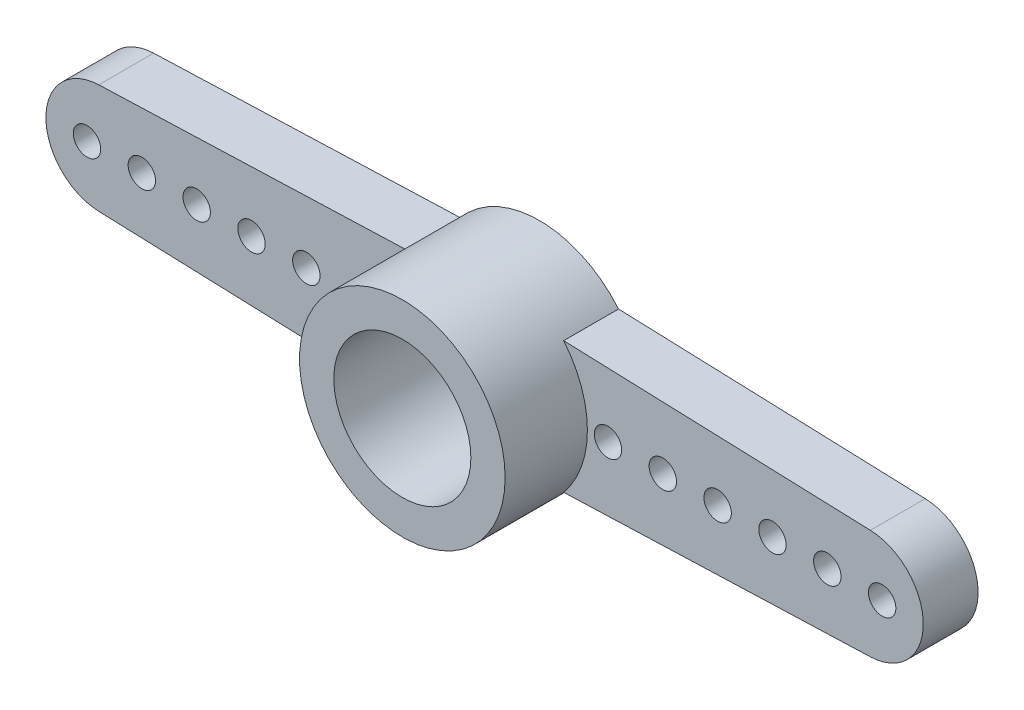
ISO-10303-21;
HEADER;
FILE_DESCRIPTION(('STEP AP214'),'2;1');
FILE_NAME('part.step','',(''),(''),'','','');
FILE_SCHEMA(('AUTOMOTIVE_DESIGN { 1 0 10303 214 1 1 1 1 }'));
ENDSEC;
DATA;
#1=APPLICATION_CONTEXT('core data for automotive mechanical design processes');
#2=APPLICATION_PROTOCOL_DEFINITION('international standard','automotive_design',2000,#1);
#3=PRODUCT_CONTEXT('',#1,'mechanical');
#4=PRODUCT('Part','Part','',(#3));
#5=PRODUCT_RELATED_PRODUCT_CATEGORY('part','',(#4));
#6=PRODUCT_DEFINITION_FORMATION('','',#4);
#7=PRODUCT_DEFINITION_CONTEXT('part definition',#1,'design');
#8=PRODUCT_DEFINITION('design','',#6,#7);
#9=PRODUCT_DEFINITION_SHAPE('','',#8);
#10=(LENGTH_UNIT() NAMED_UNIT(*) SI_UNIT(.MILLI.,.METRE.));
#11=(NAMED_UNIT(*) PLANE_ANGLE_UNIT() SI_UNIT($,.RADIAN.));
#12=(NAMED_UNIT(*) SI_UNIT($,.STERADIAN.) SOLID_ANGLE_UNIT());
#13=UNCERTAINTY_MEASURE_WITH_UNIT(LENGTH_MEASURE(1.E-05),#10,'distance_accuracy_value','');
#14=(GEOMETRIC_REPRESENTATION_CONTEXT(3) GLOBAL_UNCERTAINTY_ASSIGNED_CONTEXT((#13)) GLOBAL_UNIT_ASSIGNED_CONTEXT((#10,
#11,#12)) REPRESENTATION_CONTEXT('',''));
#15=CARTESIAN_POINT('',(0.,0.,0.));
#16=DIRECTION('',(0.,0.,1.));
#17=DIRECTION('',(1.,0.,0.));
#18=AXIS2_PLACEMENT_3D('',#15,#16,#17);
#19=CARTESIAN_POINT('',(0.,0.,0.));
#20=DIRECTION('',(0.,0.,1.));
#21=DIRECTION('',(1.,0.,0.));
#22=AXIS2_PLACEMENT_3D('',#19,#20,#21);
#23=CYLINDRICAL_SURFACE('',#22,2.5);
#24=CARTESIAN_POINT('',(0.,0.,5.));
#25=DIRECTION('',(0.,0.,1.));
#26=DIRECTION('',(1.,0.,0.));
#27=AXIS2_PLACEMENT_3D('',#24,#25,#26);
#28=CIRCLE('',#27,2.5);
#29=CARTESIAN_POINT('',(2.5,0.,5.));
#30=VERTEX_POINT('',#29);
#31=EDGE_CURVE('E347',#30,#30,#28,.T.);
#32=ORIENTED_EDGE('',*,*,#31,.T.);
#33=EDGE_LOOP('',(#32));
#34=FACE_BOUND('',#33,.T.);
#35=CARTESIAN_POINT('',(0.,0.,1.));
#36=DIRECTION('',(0.,0.,-1.));
#37=DIRECTION('',(-1.,0.,0.));
#38=AXIS2_PLACEMENT_3D('',#35,#36,#37);
#39=CIRCLE('',#38,2.5);
#40=CARTESIAN_POINT('',(-2.5,0.,1.));
#41=VERTEX_POINT('',#40);
#42=EDGE_CURVE('E254',#41,#41,#39,.T.);
#43=ORIENTED_EDGE('',*,*,#42,.T.);
#44=EDGE_LOOP('',(#43));
#45=FACE_BOUND('',#44,.T.);
#46=ADVANCED_FACE('F46',(#34,#45),#23,.F.);
#47=CARTESIAN_POINT('',(0.,0.,2.));
#48=DIRECTION('',(0.,0.,1.));
#49=DIRECTION('',(1.,0.,0.));
#50=AXIS2_PLACEMENT_3D('',#47,#48,#49);
#51=PLANE('',#50);
#52=CARTESIAN_POINT('',(-12.5,0.,2.));
#53=DIRECTION('',(0.,0.,-1.));
#54=DIRECTION('',(-1.,0.,0.));
#55=AXIS2_PLACEMENT_3D('',#52,#53,#54);
#56=CIRCLE('',#55,0.500000000000001);
#57=CARTESIAN_POINT('',(-13.,0.,2.));
#58=VERTEX_POINT('',#57);
#59=EDGE_CURVE('E268',#58,#58,#56,.F.);
#60=ORIENTED_EDGE('',*,*,#59,.F.);
#61=EDGE_LOOP('',(#60));
#62=FACE_BOUND('',#61,.T.);
#63=CARTESIAN_POINT('',(-8.5,0.,2.));
#64=DIRECTION('',(0.,0.,-1.));
#65=DIRECTION('',(-1.,0.,0.));
#66=AXIS2_PLACEMENT_3D('',#63,#64,#65);
#67=CIRCLE('',#66,0.500000000000001);
#68=CARTESIAN_POINT('',(-9.,0.,2.));
#69=VERTEX_POINT('',#68);
#70=EDGE_CURVE('E292',#69,#69,#67,.F.);
#71=ORIENTED_EDGE('',*,*,#70,.F.);
#72=EDGE_LOOP('',(#71));
#73=FACE_BOUND('',#72,.T.);
#74=CARTESIAN_POINT('',(-4.5,0.,2.));
#75=DIRECTION('',(0.,0.,-1.));
#76=DIRECTION('',(-1.,0.,0.));
#77=AXIS2_PLACEMENT_3D('',#74,#75,#76);
#78=CIRCLE('',#77,0.500000000000001);
#79=CARTESIAN_POINT('',(-5.,0.,2.));
#80=VERTEX_POINT('',#79);
#81=EDGE_CURVE('E305',#80,#80,#78,.F.);
#82=ORIENTED_EDGE('',*,*,#81,.F.);
#83=EDGE_LOOP('',(#82));
#84=FACE_BOUND('',#83,.T.);
#85=CARTESIAN_POINT('',(0.,0.,2.));
#86=DIRECTION('',(0.,0.,1.));
#87=DIRECTION('',(1.,0.,0.));
#88=AXIS2_PLACEMENT_3D('',#85,#86,#87);
#89=CIRCLE('',#88,3.75);
#90=CARTESIAN_POINT('',(-2.88547071027724,2.39511143376089,2.));
#91=VERTEX_POINT('',#90);
#92=CARTESIAN_POINT('',(-2.88547071027724,-2.39511143376089,2.));
#93=VERTEX_POINT('',#92);
#94=EDGE_CURVE('E12',#91,#93,#89,.T.);
#95=ORIENTED_EDGE('',*,*,#94,.F.);
#96=DIRECTION('',(0.999372730394994,0.0354139201848026,0.));
#97=VECTOR('',#96,1.);
#98=CARTESIAN_POINT('',(-0.0883858807695831,2.49422934631706,2.));
#99=LINE('',#98,#97);
#100=CARTESIAN_POINT('',(-14.0708278403696,1.99874546078999,2.));
#101=VERTEX_POINT('',#100);
#102=EDGE_CURVE('E215',#101,#91,#99,.T.);
#103=ORIENTED_EDGE('',*,*,#102,.F.);
#104=CARTESIAN_POINT('',(-14.,0.,2.));
#105=DIRECTION('',(0.,0.,1.));
#106=DIRECTION('',(1.,0.,0.));
#107=AXIS2_PLACEMENT_3D('',#104,#105,#106);
#108=CIRCLE('',#107,2.);
#109=CARTESIAN_POINT('',(-14.0708278403696,-1.99874546078999,2.));
#110=VERTEX_POINT('',#109);
#111=EDGE_CURVE('E206',#110,#101,#108,.F.);
#112=ORIENTED_EDGE('',*,*,#111,.F.);
#113=DIRECTION('',(0.999372730394994,-0.0354139201848024,0.));
#114=VECTOR('',#113,1.);
#115=CARTESIAN_POINT('',(-0.0883858807695825,-2.49422934631706,2.));
#116=LINE('',#115,#114);
#117=EDGE_CURVE('E211',#110,#93,#116,.T.);
#118=ORIENTED_EDGE('',*,*,#117,.T.);
#119=EDGE_LOOP('',(#95,#103,#112,#118));
#120=FACE_BOUND('',#119,.T.);
#121=CARTESIAN_POINT('',(-6.5,0.,2.));
#122=DIRECTION('',(0.,0.,-1.));
#123=DIRECTION('',(-1.,0.,0.));
#124=AXIS2_PLACEMENT_3D('',#121,#122,#123);
#125=CIRCLE('',#124,0.500000000000001);
#126=CARTESIAN_POINT('',(-7.,0.,2.));
#127=VERTEX_POINT('',#126);
#128=EDGE_CURVE('E299',#127,#127,#125,.F.);
#129=ORIENTED_EDGE('',*,*,#128,.F.);
#130=EDGE_LOOP('',(#129));
#131=FACE_BOUND('',#130,.T.);
#132=CARTESIAN_POINT('',(-10.5,0.,2.));
#133=DIRECTION('',(0.,0.,-1.));
#134=DIRECTION('',(-1.,0.,0.));
#135=AXIS2_PLACEMENT_3D('',#132,#133,#134);
#136=CIRCLE('',#135,0.500000000000001);
#137=CARTESIAN_POINT('',(-11.,0.,2.));
#138=VERTEX_POINT('',#137);
#139=EDGE_CURVE('E286',#138,#138,#136,.F.);
#140=ORIENTED_EDGE('',*,*,#139,.F.);
#141=EDGE_LOOP('',(#140));
#142=FACE_BOUND('',#141,.T.);
#143=CARTESIAN_POINT('',(-14.5,0.,2.));
#144=DIRECTION('',(0.,0.,-1.));
#145=DIRECTION('',(-1.,0.,0.));
#146=AXIS2_PLACEMENT_3D('',#143,#144,#145);
#147=CIRCLE('',#146,0.500000000000001);
#148=CARTESIAN_POINT('',(-15.,0.,2.));
#149=VERTEX_POINT('',#148);
#150=EDGE_CURVE('E269',#149,#149,#147,.F.);
#151=ORIENTED_EDGE('',*,*,#150,.F.);
#152=EDGE_LOOP('',(#151));
#153=FACE_BOUND('',#152,.T.);
#154=ADVANCED_FACE('F216',(#62,#73,#84,#120,#131,#142,#153),#51,.T.);
#155=CARTESIAN_POINT('',(0.,0.,0.));
#156=DIRECTION('',(0.,0.,1.));
#157=DIRECTION('',(1.,0.,0.));
#158=AXIS2_PLACEMENT_3D('',#155,#156,#157);
#159=PLANE('',#158);
#160=CARTESIAN_POINT('',(0.,0.,0.));
#161=DIRECTION('',(0.,0.,-1.));
#162=DIRECTION('',(-1.,0.,0.));
#163=AXIS2_PLACEMENT_3D('',#160,#161,#162);
#164=CIRCLE('',#163,2.5);
#165=CARTESIAN_POINT('',(-2.5,0.,0.));
#166=VERTEX_POINT('',#165);
#167=EDGE_CURVE('E248',#166,#166,#164,.T.);
#168=ORIENTED_EDGE('',*,*,#167,.F.);
#169=EDGE_LOOP('',(#168));
#170=FACE_BOUND('',#169,.T.);
#171=CARTESIAN_POINT('',(12.5,0.,0.));
#172=DIRECTION('',(0.,0.,-1.));
#173=DIRECTION('',(-1.,0.,0.));
#174=AXIS2_PLACEMENT_3D('',#171,#172,#173);
#175=CIRCLE('',#174,0.500000000000001);
#176=CARTESIAN_POINT('',(12.,0.,0.));
#177=VERTEX_POINT('',#176);
#178=EDGE_CURVE('E279',#177,#177,#175,.T.);
#179=ORIENTED_EDGE('',*,*,#178,.F.);
#180=EDGE_LOOP('',(#179));
#181=FACE_BOUND('',#180,.T.);
#182=CARTESIAN_POINT('',(-12.5,0.,0.));
#183=DIRECTION('',(0.,0.,-1.));
#184=DIRECTION('',(-1.,0.,0.));
#185=AXIS2_PLACEMENT_3D('',#182,#183,#184);
#186=CIRCLE('',#185,0.500000000000001);
#187=CARTESIAN_POINT('',(-13.,0.,0.));
#188=VERTEX_POINT('',#187);
#189=EDGE_CURVE('E275',#188,#188,#186,.F.);
#190=ORIENTED_EDGE('',*,*,#189,.T.);
#191=EDGE_LOOP('',(#190));
#192=FACE_BOUND('',#191,.T.);
#193=CARTESIAN_POINT('',(-8.5,0.,0.));
#194=DIRECTION('',(0.,0.,-1.));
#195=DIRECTION('',(-1.,0.,0.));
#196=AXIS2_PLACEMENT_3D('',#193,#194,#195);
#197=CIRCLE('',#196,0.500000000000001);
#198=CARTESIAN_POINT('',(-9.,0.,0.));
#199=VERTEX_POINT('',#198);
#200=EDGE_CURVE('E295',#199,#199,#197,.F.);
#201=ORIENTED_EDGE('',*,*,#200,.T.);
#202=EDGE_LOOP('',(#201));
#203=FACE_BOUND('',#202,.T.);
#204=CARTESIAN_POINT('',(-4.5,0.,0.));
#205=DIRECTION('',(0.,0.,-1.));
#206=DIRECTION('',(-1.,0.,0.));
#207=AXIS2_PLACEMENT_3D('',#204,#205,#206);
#208=CIRCLE('',#207,0.500000000000001);
#209=CARTESIAN_POINT('',(-5.,0.,0.));
#210=VERTEX_POINT('',#209);
#211=EDGE_CURVE('E308',#210,#210,#208,.F.);
#212=ORIENTED_EDGE('',*,*,#211,.T.);
#213=EDGE_LOOP('',(#212));
#214=FACE_BOUND('',#213,.T.);
#215=CARTESIAN_POINT('',(4.5,0.,0.));
#216=DIRECTION('',(0.,0.,-1.));
#217=DIRECTION('',(-1.,0.,0.));
#218=AXIS2_PLACEMENT_3D('',#215,#216,#217);
#219=CIRCLE('',#218,0.500000000000001);
#220=CARTESIAN_POINT('',(4.,0.,0.));
#221=VERTEX_POINT('',#220);
#222=EDGE_CURVE('E315',#221,#221,#219,.T.);
#223=ORIENTED_EDGE('',*,*,#222,.F.);
#224=EDGE_LOOP('',(#223));
#225=FACE_BOUND('',#224,.T.);
#226=CARTESIAN_POINT('',(6.5,0.,0.));
#227=DIRECTION('',(0.,0.,-1.));
#228=DIRECTION('',(-1.,0.,0.));
#229=AXIS2_PLACEMENT_3D('',#226,#227,#228);
#230=CIRCLE('',#229,0.500000000000001);
#231=CARTESIAN_POINT('',(6.,0.,0.));
#232=VERTEX_POINT('',#231);
#233=EDGE_CURVE('E321',#232,#232,#230,.T.);
#234=ORIENTED_EDGE('',*,*,#233,.F.);
#235=EDGE_LOOP('',(#234));
#236=FACE_BOUND('',#235,.T.);
#237=CARTESIAN_POINT('',(8.5,0.,0.));
#238=DIRECTION('',(0.,0.,-1.));
#239=DIRECTION('',(-1.,0.,0.));
#240=AXIS2_PLACEMENT_3D('',#237,#238,#239);
#241=CIRCLE('',#240,0.500000000000001);
#242=CARTESIAN_POINT('',(8.,0.,0.));
#243=VERTEX_POINT('',#242);
#244=EDGE_CURVE('E328',#243,#243,#241,.T.);
#245=ORIENTED_EDGE('',*,*,#244,.F.);
#246=EDGE_LOOP('',(#245));
#247=FACE_BOUND('',#246,.T.);
#248=CARTESIAN_POINT('',(10.5,0.,0.));
#249=DIRECTION('',(0.,0.,-1.));
#250=DIRECTION('',(-1.,0.,0.));
#251=AXIS2_PLACEMENT_3D('',#248,#249,#250);
#252=CIRCLE('',#251,0.500000000000001);
#253=CARTESIAN_POINT('',(10.,0.,0.));
#254=VERTEX_POINT('',#253);
#255=EDGE_CURVE('E336',#254,#254,#252,.T.);
#256=ORIENTED_EDGE('',*,*,#255,.F.);
#257=EDGE_LOOP('',(#256));
#258=FACE_BOUND('',#257,.T.);
#259=CARTESIAN_POINT('',(14.5,0.,0.));
#260=DIRECTION('',(0.,0.,-1.));
#261=DIRECTION('',(-1.,0.,0.));
#262=AXIS2_PLACEMENT_3D('',#259,#260,#261);
#263=CIRCLE('',#262,0.500000000000001);
#264=CARTESIAN_POINT('',(14.,0.,0.));
#265=VERTEX_POINT('',#264);
#266=EDGE_CURVE('E340',#265,#265,#263,.T.);
#267=ORIENTED_EDGE('',*,*,#266,.F.);
#268=EDGE_LOOP('',(#267));
#269=FACE_BOUND('',#268,.T.);
#270=DIRECTION('',(-0.999372730394994,-0.0354139201848029,0.));
#271=VECTOR('',#270,1.);
#272=CARTESIAN_POINT('',(0.0883858807695838,-2.49422934631706,0.));
#273=LINE('',#272,#271);
#274=CARTESIAN_POINT('',(14.0708278403696,-1.99874546078998,0.));
#275=VERTEX_POINT('',#274);
#276=CARTESIAN_POINT('',(2.88547071027724,-2.39511143376089,0.));
#277=VERTEX_POINT('',#276);
#278=EDGE_CURVE('E130',#275,#277,#273,.T.);
#279=ORIENTED_EDGE('',*,*,#278,.T.);
#280=CARTESIAN_POINT('',(0.,0.,0.));
#281=DIRECTION('',(0.,0.,-1.));
#282=DIRECTION('',(-1.,0.,0.));
#283=AXIS2_PLACEMENT_3D('',#280,#281,#282);
#284=CIRCLE('',#283,3.75);
#285=CARTESIAN_POINT('',(-2.88547071027724,-2.39511143376089,0.));
#286=VERTEX_POINT('',#285);
#287=EDGE_CURVE('E103',#277,#286,#284,.T.);
#288=ORIENTED_EDGE('',*,*,#287,.T.);
#289=DIRECTION('',(0.999372730394994,-0.0354139201848024,0.));
#290=VECTOR('',#289,1.);
#291=CARTESIAN_POINT('',(-0.0883858807695825,-2.49422934631706,0.));
#292=LINE('',#291,#290);
#293=CARTESIAN_POINT('',(-14.0708278403696,-1.99874546078999,0.));
#294=VERTEX_POINT('',#293);
#295=EDGE_CURVE('E172',#294,#286,#292,.T.);
#296=ORIENTED_EDGE('',*,*,#295,.F.);
#297=CARTESIAN_POINT('',(-14.,0.,0.));
#298=DIRECTION('',(0.,0.,1.));
#299=DIRECTION('',(1.,0.,0.));
#300=AXIS2_PLACEMENT_3D('',#297,#298,#299);
#301=CIRCLE('',#300,2.);
#302=CARTESIAN_POINT('',(-14.0708278403696,1.99874546078999,0.));
#303=VERTEX_POINT('',#302);
#304=EDGE_CURVE('E208',#294,#303,#301,.F.);
#305=ORIENTED_EDGE('',*,*,#304,.T.);
#306=DIRECTION('',(0.999372730394994,0.0354139201848026,0.));
#307=VECTOR('',#306,1.);
#308=CARTESIAN_POINT('',(-0.0883858807695831,2.49422934631706,0.));
#309=LINE('',#308,#307);
#310=CARTESIAN_POINT('',(-2.88547071027724,2.39511143376089,0.));
#311=VERTEX_POINT('',#310);
#312=EDGE_CURVE('E64',#303,#311,#309,.T.);
#313=ORIENTED_EDGE('',*,*,#312,.T.);
#314=CARTESIAN_POINT('',(2.88547071027724,2.39511143376089,0.));
#315=VERTEX_POINT('',#314);
#316=EDGE_CURVE('E92',#311,#315,#284,.T.);
#317=ORIENTED_EDGE('',*,*,#316,.T.);
#318=DIRECTION('',(-0.999372730394994,0.0354139201848023,0.));
#319=VECTOR('',#318,1.);
#320=CARTESIAN_POINT('',(0.0883858807695825,2.49422934631706,0.));
#321=LINE('',#320,#319);
#322=CARTESIAN_POINT('',(14.0708278403696,1.99874546078999,0.));
#323=VERTEX_POINT('',#322);
#324=EDGE_CURVE('E99',#323,#315,#321,.T.);
#325=ORIENTED_EDGE('',*,*,#324,.F.);
#326=CARTESIAN_POINT('',(14.,0.,0.));
#327=DIRECTION('',(0.,0.,1.));
#328=DIRECTION('',(1.,0.,0.));
#329=AXIS2_PLACEMENT_3D('',#326,#327,#328);
#330=CIRCLE('',#329,2.);
#331=EDGE_CURVE('E123',#275,#323,#330,.T.);
#332=ORIENTED_EDGE('',*,*,#331,.F.);
#333=EDGE_LOOP('',(#279,#288,#296,#305,#313,#317,#325,#332));
#334=FACE_BOUND('',#333,.T.);
#335=CARTESIAN_POINT('',(-6.5,0.,0.));
#336=DIRECTION('',(0.,0.,-1.));
#337=DIRECTION('',(-1.,0.,0.));
#338=AXIS2_PLACEMENT_3D('',#335,#336,#337);
#339=CIRCLE('',#338,0.500000000000001);
#340=CARTESIAN_POINT('',(-7.,0.,0.));
#341=VERTEX_POINT('',#340);
#342=EDGE_CURVE('E302',#341,#341,#339,.F.);
#343=ORIENTED_EDGE('',*,*,#342,.T.);
#344=EDGE_LOOP('',(#343));
#345=FACE_BOUND('',#344,.T.);
#346=CARTESIAN_POINT('',(-10.5,0.,0.));
#347=DIRECTION('',(0.,0.,-1.));
#348=DIRECTION('',(-1.,0.,0.));
#349=AXIS2_PLACEMENT_3D('',#346,#347,#348);
#350=CIRCLE('',#349,0.500000000000001);
#351=CARTESIAN_POINT('',(-11.,0.,0.));
#352=VERTEX_POINT('',#351);
#353=EDGE_CURVE('E288',#352,#352,#350,.F.);
#354=ORIENTED_EDGE('',*,*,#353,.T.);
#355=EDGE_LOOP('',(#354));
#356=FACE_BOUND('',#355,.T.);
#357=CARTESIAN_POINT('',(-14.5,0.,0.));
#358=DIRECTION('',(0.,0.,-1.));
#359=DIRECTION('',(-1.,0.,0.));
#360=AXIS2_PLACEMENT_3D('',#357,#358,#359);
#361=CIRCLE('',#360,0.500000000000001);
#362=CARTESIAN_POINT('',(-15.,0.,0.));
#363=VERTEX_POINT('',#362);
#364=EDGE_CURVE('E266',#363,#363,#361,.F.);
#365=ORIENTED_EDGE('',*,*,#364,.T.);
#366=EDGE_LOOP('',(#365));
#367=FACE_BOUND('',#366,.T.);
#368=ADVANCED_FACE('F95',(#170,#181,#192,#203,#214,#225,#236,#247,#258,#269,#334,#345,#356,
#367),#159,.F.);
#369=CARTESIAN_POINT('',(0.0883858807695838,-2.49422934631706,2.));
#370=DIRECTION('',(0.0354139201848029,-0.999372730394994,0.));
#371=DIRECTION('',(0.999372730394994,0.0354139201848029,0.));
#372=AXIS2_PLACEMENT_3D('',#369,#370,#371);
#373=PLANE('',#372);
#374=ORIENTED_EDGE('',*,*,#278,.F.);
#375=DIRECTION('',(0.,0.,-1.));
#376=VECTOR('',#375,1.);
#377=CARTESIAN_POINT('',(14.0708278403696,-1.99874546078998,2.));
#378=LINE('',#377,#376);
#379=CARTESIAN_POINT('',(14.0708278403696,-1.99874546078998,2.));
#380=VERTEX_POINT('',#379);
#381=EDGE_CURVE('E136',#380,#275,#378,.T.);
#382=ORIENTED_EDGE('',*,*,#381,.F.);
#383=DIRECTION('',(-0.999372730394994,-0.0354139201848029,0.));
#384=VECTOR('',#383,1.);
#385=CARTESIAN_POINT('',(0.0883858807695838,-2.49422934631706,2.));
#386=LINE('',#385,#384);
#387=CARTESIAN_POINT('',(2.88547071027724,-2.39511143376089,2.));
#388=VERTEX_POINT('',#387);
#389=EDGE_CURVE('E122',#380,#388,#386,.T.);
#390=ORIENTED_EDGE('',*,*,#389,.T.);
#391=DIRECTION('',(0.,0.,-1.));
#392=VECTOR('',#391,1.);
#393=CARTESIAN_POINT('',(2.88547071027724,-2.39511143376089,2.));
#394=LINE('',#393,#392);
#395=EDGE_CURVE('E117',#388,#277,#394,.T.);
#396=ORIENTED_EDGE('',*,*,#395,.T.);
#397=EDGE_LOOP('',(#374,#382,#390,#396));
#398=FACE_BOUND('',#397,.T.);
#399=ADVANCED_FACE('F48',(#398),#373,.T.);
#400=CARTESIAN_POINT('',(14.,0.,2.));
#401=DIRECTION('',(0.,0.,-1.));
#402=DIRECTION('',(-1.,0.,0.));
#403=AXIS2_PLACEMENT_3D('',#400,#401,#402);
#404=CYLINDRICAL_SURFACE('',#403,2.);
#405=ORIENTED_EDGE('',*,*,#331,.T.);
#406=DIRECTION('',(0.,0.,-1.));
#407=VECTOR('',#406,1.);
#408=CARTESIAN_POINT('',(14.0708278403696,1.99874546078999,2.));
#409=LINE('',#408,#407);
#410=CARTESIAN_POINT('',(14.0708278403696,1.99874546078999,2.));
#411=VERTEX_POINT('',#410);
#412=EDGE_CURVE('E116',#411,#323,#409,.T.);
#413=ORIENTED_EDGE('',*,*,#412,.F.);
#414=CARTESIAN_POINT('',(14.,0.,2.));
#415=DIRECTION('',(0.,0.,1.));
#416=DIRECTION('',(1.,0.,0.));
#417=AXIS2_PLACEMENT_3D('',#414,#415,#416);
#418=CIRCLE('',#417,2.);
#419=EDGE_CURVE('E76',#380,#411,#418,.T.);
#420=ORIENTED_EDGE('',*,*,#419,.F.);
#421=ORIENTED_EDGE('',*,*,#381,.T.);
#422=EDGE_LOOP('',(#405,#413,#420,#421));
#423=FACE_BOUND('',#422,.T.);
#424=ADVANCED_FACE('F502',(#423),#404,.T.);
#425=CARTESIAN_POINT('',(0.0883858807695825,2.49422934631706,2.));
#426=DIRECTION('',(-0.0354139201848023,-0.999372730394994,0.));
#427=DIRECTION('',(0.999372730394994,-0.0354139201848023,0.));
#428=AXIS2_PLACEMENT_3D('',#425,#426,#427);
#429=PLANE('',#428);
#430=ORIENTED_EDGE('',*,*,#324,.T.);
#431=DIRECTION('',(0.,0.,-1.));
#432=VECTOR('',#431,1.);
#433=CARTESIAN_POINT('',(2.88547071027724,2.39511143376089,2.));
#434=LINE('',#433,#432);
#435=CARTESIAN_POINT('',(2.88547071027724,2.39511143376089,2.));
#436=VERTEX_POINT('',#435);
#437=EDGE_CURVE('E108',#436,#315,#434,.T.);
#438=ORIENTED_EDGE('',*,*,#437,.F.);
#439=DIRECTION('',(-0.999372730394994,0.0354139201848023,0.));
#440=VECTOR('',#439,1.);
#441=CARTESIAN_POINT('',(0.0883858807695825,2.49422934631706,2.));
#442=LINE('',#441,#440);
#443=EDGE_CURVE('E151',#411,#436,#442,.T.);
#444=ORIENTED_EDGE('',*,*,#443,.F.);
#445=ORIENTED_EDGE('',*,*,#412,.T.);
#446=EDGE_LOOP('',(#430,#438,#444,#445));
#447=FACE_BOUND('',#446,.T.);
#448=ADVANCED_FACE('F120',(#447),#429,.F.);
#449=CARTESIAN_POINT('',(12.5,0.,2.));
#450=DIRECTION('',(0.,0.,-1.));
#451=DIRECTION('',(-1.,0.,0.));
#452=AXIS2_PLACEMENT_3D('',#449,#450,#451);
#453=CIRCLE('',#452,0.500000000000001);
#454=CARTESIAN_POINT('',(12.,0.,2.));
#455=VERTEX_POINT('',#454);
#456=EDGE_CURVE('E257',#455,#455,#453,.T.);
#457=ORIENTED_EDGE('',*,*,#456,.T.);
#458=EDGE_LOOP('',(#457));
#459=FACE_BOUND('',#458,.T.);
#460=CARTESIAN_POINT('',(4.5,0.,2.));
#461=DIRECTION('',(0.,0.,-1.));
#462=DIRECTION('',(-1.,0.,0.));
#463=AXIS2_PLACEMENT_3D('',#460,#461,#462);
#464=CIRCLE('',#463,0.500000000000001);
#465=CARTESIAN_POINT('',(4.,0.,2.));
#466=VERTEX_POINT('',#465);
#467=EDGE_CURVE('E311',#466,#466,#464,.T.);
#468=ORIENTED_EDGE('',*,*,#467,.T.);
#469=EDGE_LOOP('',(#468));
#470=FACE_BOUND('',#469,.T.);
#471=CARTESIAN_POINT('',(6.5,0.,2.));
#472=DIRECTION('',(0.,0.,-1.));
#473=DIRECTION('',(-1.,0.,0.));
#474=AXIS2_PLACEMENT_3D('',#471,#472,#473);
#475=CIRCLE('',#474,0.500000000000001);
#476=CARTESIAN_POINT('',(6.,0.,2.));
#477=VERTEX_POINT('',#476);
#478=EDGE_CURVE('E318',#477,#477,#475,.T.);
#479=ORIENTED_EDGE('',*,*,#478,.T.);
#480=EDGE_LOOP('',(#479));
#481=FACE_BOUND('',#480,.T.);
#482=CARTESIAN_POINT('',(8.5,0.,2.));
#483=DIRECTION('',(0.,0.,-1.));
#484=DIRECTION('',(-1.,0.,0.));
#485=AXIS2_PLACEMENT_3D('',#482,#483,#484);
#486=CIRCLE('',#485,0.500000000000001);
#487=CARTESIAN_POINT('',(8.,0.,2.));
#488=VERTEX_POINT('',#487);
#489=EDGE_CURVE('E324',#488,#488,#486,.T.);
#490=ORIENTED_EDGE('',*,*,#489,.T.);
#491=EDGE_LOOP('',(#490));
#492=FACE_BOUND('',#491,.T.);
#493=CARTESIAN_POINT('',(10.5,0.,2.));
#494=DIRECTION('',(0.,0.,-1.));
#495=DIRECTION('',(-1.,0.,0.));
#496=AXIS2_PLACEMENT_3D('',#493,#494,#495);
#497=CIRCLE('',#496,0.500000000000001);
#498=CARTESIAN_POINT('',(10.,0.,2.));
#499=VERTEX_POINT('',#498);
#500=EDGE_CURVE('E332',#499,#499,#497,.T.);
#501=ORIENTED_EDGE('',*,*,#500,.T.);
#502=EDGE_LOOP('',(#501));
#503=FACE_BOUND('',#502,.T.);
#504=CARTESIAN_POINT('',(14.5,0.,2.));
#505=DIRECTION('',(0.,0.,-1.));
#506=DIRECTION('',(-1.,0.,0.));
#507=AXIS2_PLACEMENT_3D('',#504,#505,#506);
#508=CIRCLE('',#507,0.500000000000001);
#509=CARTESIAN_POINT('',(14.,0.,2.));
#510=VERTEX_POINT('',#509);
#511=EDGE_CURVE('E344',#510,#510,#508,.T.);
#512=ORIENTED_EDGE('',*,*,#511,.T.);
#513=EDGE_LOOP('',(#512));
#514=FACE_BOUND('',#513,.T.);
#515=EDGE_CURVE('E56',#388,#436,#89,.T.);
#516=ORIENTED_EDGE('',*,*,#515,.F.);
#517=ORIENTED_EDGE('',*,*,#389,.F.);
#518=ORIENTED_EDGE('',*,*,#419,.T.);
#519=ORIENTED_EDGE('',*,*,#443,.T.);
#520=EDGE_LOOP('',(#516,#517,#518,#519));
#521=FACE_BOUND('',#520,.T.);
#522=ADVANCED_FACE('F360',(#459,#470,#481,#492,#503,#514,#521),#51,.T.);
#523=CARTESIAN_POINT('',(0.,0.,0.));
#524=DIRECTION('',(0.,0.,1.));
#525=DIRECTION('',(1.,0.,0.));
#526=AXIS2_PLACEMENT_3D('',#523,#524,#525);
#527=CYLINDRICAL_SURFACE('',#526,3.75);
#528=ORIENTED_EDGE('',*,*,#316,.F.);
#529=DIRECTION('',(0.,0.,-1.));
#530=VECTOR('',#529,1.);
#531=CARTESIAN_POINT('',(-2.88547071027724,2.39511143376089,2.));
#532=LINE('',#531,#530);
#533=EDGE_CURVE('E233',#91,#311,#532,.T.);
#534=ORIENTED_EDGE('',*,*,#533,.F.);
#535=ORIENTED_EDGE('',*,*,#94,.T.);
#536=DIRECTION('',(0.,0.,-1.));
#537=VECTOR('',#536,1.);
#538=CARTESIAN_POINT('',(-2.88547071027724,-2.39511143376089,2.));
#539=LINE('',#538,#537);
#540=EDGE_CURVE('E178',#93,#286,#539,.T.);
#541=ORIENTED_EDGE('',*,*,#540,.T.);
#542=ORIENTED_EDGE('',*,*,#287,.F.);
#543=ORIENTED_EDGE('',*,*,#395,.F.);
#544=ORIENTED_EDGE('',*,*,#515,.T.);
#545=ORIENTED_EDGE('',*,*,#437,.T.);
#546=EDGE_LOOP('',(#528,#534,#535,#541,#542,#543,#544,#545));
#547=FACE_BOUND('',#546,.T.);
#548=CARTESIAN_POINT('',(0.,0.,5.));
#549=DIRECTION('',(0.,0.,1.));
#550=DIRECTION('',(1.,0.,0.));
#551=AXIS2_PLACEMENT_3D('',#548,#549,#550);
#552=CIRCLE('',#551,3.75);
#553=CARTESIAN_POINT('',(3.75,0.,5.));
#554=VERTEX_POINT('',#553);
#555=EDGE_CURVE('E225',#554,#554,#552,.T.);
#556=ORIENTED_EDGE('',*,*,#555,.F.);
#557=EDGE_LOOP('',(#556));
#558=FACE_BOUND('',#557,.T.);
#559=ADVANCED_FACE('F109',(#547,#558),#527,.T.);
#560=CARTESIAN_POINT('',(-14.,0.,2.));
#561=DIRECTION('',(0.,0.,-1.));
#562=DIRECTION('',(-1.,0.,0.));
#563=AXIS2_PLACEMENT_3D('',#560,#561,#562);
#564=CYLINDRICAL_SURFACE('',#563,2.);
#565=ORIENTED_EDGE('',*,*,#304,.F.);
#566=DIRECTION('',(0.,0.,-1.));
#567=VECTOR('',#566,1.);
#568=CARTESIAN_POINT('',(-14.0708278403696,-1.99874546078999,2.));
#569=LINE('',#568,#567);
#570=EDGE_CURVE('E104',#110,#294,#569,.T.);
#571=ORIENTED_EDGE('',*,*,#570,.F.);
#572=ORIENTED_EDGE('',*,*,#111,.T.);
#573=DIRECTION('',(0.,0.,-1.));
#574=VECTOR('',#573,1.);
#575=CARTESIAN_POINT('',(-14.0708278403696,1.99874546078999,2.));
#576=LINE('',#575,#574);
#577=EDGE_CURVE('E231',#101,#303,#576,.T.);
#578=ORIENTED_EDGE('',*,*,#577,.T.);
#579=EDGE_LOOP('',(#565,#571,#572,#578));
#580=FACE_BOUND('',#579,.T.);
#581=ADVANCED_FACE('F204',(#580),#564,.T.);
#582=CARTESIAN_POINT('',(-0.0883858807695825,-2.49422934631706,2.));
#583=DIRECTION('',(0.0354139201848024,0.999372730394994,0.));
#584=DIRECTION('',(-0.999372730394994,0.0354139201848024,0.));
#585=AXIS2_PLACEMENT_3D('',#582,#583,#584);
#586=PLANE('',#585);
#587=ORIENTED_EDGE('',*,*,#295,.T.);
#588=ORIENTED_EDGE('',*,*,#540,.F.);
#589=ORIENTED_EDGE('',*,*,#117,.F.);
#590=ORIENTED_EDGE('',*,*,#570,.T.);
#591=EDGE_LOOP('',(#587,#588,#589,#590));
#592=FACE_BOUND('',#591,.T.);
#593=ADVANCED_FACE('F212',(#592),#586,.F.);
#594=CARTESIAN_POINT('',(-0.0883858807695831,2.49422934631706,2.));
#595=DIRECTION('',(-0.0354139201848026,0.999372730394994,0.));
#596=DIRECTION('',(-0.999372730394994,-0.0354139201848026,0.));
#597=AXIS2_PLACEMENT_3D('',#594,#595,#596);
#598=PLANE('',#597);
#599=ORIENTED_EDGE('',*,*,#312,.F.);
#600=ORIENTED_EDGE('',*,*,#577,.F.);
#601=ORIENTED_EDGE('',*,*,#102,.T.);
#602=ORIENTED_EDGE('',*,*,#533,.T.);
#603=EDGE_LOOP('',(#599,#600,#601,#602));
#604=FACE_BOUND('',#603,.T.);
#605=ADVANCED_FACE('F379',(#604),#598,.T.);
#606=CARTESIAN_POINT('',(0.,0.,5.));
#607=DIRECTION('',(0.,0.,1.));
#608=DIRECTION('',(1.,0.,0.));
#609=AXIS2_PLACEMENT_3D('',#606,#607,#608);
#610=PLANE('',#609);
#611=ORIENTED_EDGE('',*,*,#555,.T.);
#612=EDGE_LOOP('',(#611));
#613=FACE_BOUND('',#612,.T.);
#614=ORIENTED_EDGE('',*,*,#31,.F.);
#615=EDGE_LOOP('',(#614));
#616=FACE_BOUND('',#615,.T.);
#617=ADVANCED_FACE('F357',(#613,#616),#610,.T.);
#618=CARTESIAN_POINT('',(14.5,0.,2.));
#619=DIRECTION('',(0.,0.,-1.));
#620=DIRECTION('',(-1.,0.,0.));
#621=AXIS2_PLACEMENT_3D('',#618,#619,#620);
#622=CYLINDRICAL_SURFACE('',#621,0.500000000000001);
#623=ORIENTED_EDGE('',*,*,#511,.F.);
#624=EDGE_LOOP('',(#623));
#625=FACE_BOUND('',#624,.T.);
#626=ORIENTED_EDGE('',*,*,#266,.T.);
#627=EDGE_LOOP('',(#626));
#628=FACE_BOUND('',#627,.T.);
#629=ADVANCED_FACE('F384',(#625,#628),#622,.F.);
#630=CARTESIAN_POINT('',(10.5,0.,2.));
#631=DIRECTION('',(0.,0.,-1.));
#632=DIRECTION('',(-1.,0.,0.));
#633=AXIS2_PLACEMENT_3D('',#630,#631,#632);
#634=CYLINDRICAL_SURFACE('',#633,0.500000000000001);
#635=ORIENTED_EDGE('',*,*,#500,.F.);
#636=EDGE_LOOP('',(#635));
#637=FACE_BOUND('',#636,.T.);
#638=ORIENTED_EDGE('',*,*,#255,.T.);
#639=EDGE_LOOP('',(#638));
#640=FACE_BOUND('',#639,.T.);
#641=ADVANCED_FACE('F387',(#637,#640),#634,.F.);
#642=CARTESIAN_POINT('',(8.5,0.,2.));
#643=DIRECTION('',(0.,0.,-1.));
#644=DIRECTION('',(-1.,0.,0.));
#645=AXIS2_PLACEMENT_3D('',#642,#643,#644);
#646=CYLINDRICAL_SURFACE('',#645,0.500000000000001);
#647=ORIENTED_EDGE('',*,*,#489,.F.);
#648=EDGE_LOOP('',(#647));
#649=FACE_BOUND('',#648,.T.);
#650=ORIENTED_EDGE('',*,*,#244,.T.);
#651=EDGE_LOOP('',(#650));
#652=FACE_BOUND('',#651,.T.);
#653=ADVANCED_FACE('F391',(#649,#652),#646,.F.);
#654=CARTESIAN_POINT('',(6.5,0.,2.));
#655=DIRECTION('',(0.,0.,-1.));
#656=DIRECTION('',(-1.,0.,0.));
#657=AXIS2_PLACEMENT_3D('',#654,#655,#656);
#658=CYLINDRICAL_SURFACE('',#657,0.500000000000001);
#659=ORIENTED_EDGE('',*,*,#478,.F.);
#660=EDGE_LOOP('',(#659));
#661=FACE_BOUND('',#660,.T.);
#662=ORIENTED_EDGE('',*,*,#233,.T.);
#663=EDGE_LOOP('',(#662));
#664=FACE_BOUND('',#663,.T.);
#665=ADVANCED_FACE('F395',(#661,#664),#658,.F.);
#666=CARTESIAN_POINT('',(4.5,0.,2.));
#667=DIRECTION('',(0.,0.,-1.));
#668=DIRECTION('',(-1.,0.,0.));
#669=AXIS2_PLACEMENT_3D('',#666,#667,#668);
#670=CYLINDRICAL_SURFACE('',#669,0.500000000000001);
#671=ORIENTED_EDGE('',*,*,#467,.F.);
#672=EDGE_LOOP('',(#671));
#673=FACE_BOUND('',#672,.T.);
#674=ORIENTED_EDGE('',*,*,#222,.T.);
#675=EDGE_LOOP('',(#674));
#676=FACE_BOUND('',#675,.T.);
#677=ADVANCED_FACE('F399',(#673,#676),#670,.F.);
#678=CARTESIAN_POINT('',(-4.5,0.,2.));
#679=DIRECTION('',(0.,0.,-1.));
#680=DIRECTION('',(-1.,0.,0.));
#681=AXIS2_PLACEMENT_3D('',#678,#679,#680);
#682=CYLINDRICAL_SURFACE('',#681,0.500000000000001);
#683=ORIENTED_EDGE('',*,*,#81,.T.);
#684=EDGE_LOOP('',(#683));
#685=FACE_BOUND('',#684,.T.);
#686=ORIENTED_EDGE('',*,*,#211,.F.);
#687=EDGE_LOOP('',(#686));
#688=FACE_BOUND('',#687,.T.);
#689=ADVANCED_FACE('F403',(#685,#688),#682,.F.);
#690=CARTESIAN_POINT('',(-6.5,0.,2.));
#691=DIRECTION('',(0.,0.,-1.));
#692=DIRECTION('',(-1.,0.,0.));
#693=AXIS2_PLACEMENT_3D('',#690,#691,#692);
#694=CYLINDRICAL_SURFACE('',#693,0.500000000000001);
#695=ORIENTED_EDGE('',*,*,#128,.T.);
#696=EDGE_LOOP('',(#695));
#697=FACE_BOUND('',#696,.T.);
#698=ORIENTED_EDGE('',*,*,#342,.F.);
#699=EDGE_LOOP('',(#698));
#700=FACE_BOUND('',#699,.T.);
#701=ADVANCED_FACE('F407',(#697,#700),#694,.F.);
#702=CARTESIAN_POINT('',(-8.5,0.,2.));
#703=DIRECTION('',(0.,0.,-1.));
#704=DIRECTION('',(-1.,0.,0.));
#705=AXIS2_PLACEMENT_3D('',#702,#703,#704);
#706=CYLINDRICAL_SURFACE('',#705,0.500000000000001);
#707=ORIENTED_EDGE('',*,*,#70,.T.);
#708=EDGE_LOOP('',(#707));
#709=FACE_BOUND('',#708,.T.);
#710=ORIENTED_EDGE('',*,*,#200,.F.);
#711=EDGE_LOOP('',(#710));
#712=FACE_BOUND('',#711,.T.);
#713=ADVANCED_FACE('F411',(#709,#712),#706,.F.);
#714=CARTESIAN_POINT('',(-10.5,0.,2.));
#715=DIRECTION('',(0.,0.,-1.));
#716=DIRECTION('',(-1.,0.,0.));
#717=AXIS2_PLACEMENT_3D('',#714,#715,#716);
#718=CYLINDRICAL_SURFACE('',#717,0.500000000000001);
#719=ORIENTED_EDGE('',*,*,#139,.T.);
#720=EDGE_LOOP('',(#719));
#721=FACE_BOUND('',#720,.T.);
#722=ORIENTED_EDGE('',*,*,#353,.F.);
#723=EDGE_LOOP('',(#722));
#724=FACE_BOUND('',#723,.T.);
#725=ADVANCED_FACE('F415',(#721,#724),#718,.F.);
#726=CARTESIAN_POINT('',(-12.5,0.,2.));
#727=DIRECTION('',(0.,0.,-1.));
#728=DIRECTION('',(-1.,0.,0.));
#729=AXIS2_PLACEMENT_3D('',#726,#727,#728);
#730=CYLINDRICAL_SURFACE('',#729,0.500000000000001);
#731=ORIENTED_EDGE('',*,*,#59,.T.);
#732=EDGE_LOOP('',(#731));
#733=FACE_BOUND('',#732,.T.);
#734=ORIENTED_EDGE('',*,*,#189,.F.);
#735=EDGE_LOOP('',(#734));
#736=FACE_BOUND('',#735,.T.);
#737=ADVANCED_FACE('F419',(#733,#736),#730,.F.);
#738=CARTESIAN_POINT('',(-14.5,0.,2.));
#739=DIRECTION('',(0.,0.,-1.));
#740=DIRECTION('',(-1.,0.,0.));
#741=AXIS2_PLACEMENT_3D('',#738,#739,#740);
#742=CYLINDRICAL_SURFACE('',#741,0.500000000000001);
#743=ORIENTED_EDGE('',*,*,#150,.T.);
#744=EDGE_LOOP('',(#743));
#745=FACE_BOUND('',#744,.T.);
#746=ORIENTED_EDGE('',*,*,#364,.F.);
#747=EDGE_LOOP('',(#746));
#748=FACE_BOUND('',#747,.T.);
#749=ADVANCED_FACE('F423',(#745,#748),#742,.F.);
#750=CARTESIAN_POINT('',(12.5,0.,2.));
#751=DIRECTION('',(0.,0.,-1.));
#752=DIRECTION('',(-1.,0.,0.));
#753=AXIS2_PLACEMENT_3D('',#750,#751,#752);
#754=CYLINDRICAL_SURFACE('',#753,0.500000000000001);
#755=ORIENTED_EDGE('',*,*,#456,.F.);
#756=EDGE_LOOP('',(#755));
#757=FACE_BOUND('',#756,.T.);
#758=ORIENTED_EDGE('',*,*,#178,.T.);
#759=EDGE_LOOP('',(#758));
#760=FACE_BOUND('',#759,.T.);
#761=ADVANCED_FACE('F427',(#757,#760),#754,.F.);
#762=CARTESIAN_POINT('',(0.,0.,1.));
#763=DIRECTION('',(0.,0.,-1.));
#764=DIRECTION('',(-1.,0.,0.));
#765=AXIS2_PLACEMENT_3D('',#762,#763,#764);
#766=PLANE('',#765);
#767=CARTESIAN_POINT('',(0.,0.,1.));
#768=DIRECTION('',(0.,0.,-1.));
#769=DIRECTION('',(-1.,0.,0.));
#770=AXIS2_PLACEMENT_3D('',#767,#768,#769);
#771=CIRCLE('',#770,1.25);
#772=CARTESIAN_POINT('',(-1.25,0.,1.));
#773=VERTEX_POINT('',#772);
#774=EDGE_CURVE('E245',#773,#773,#771,.T.);
#775=ORIENTED_EDGE('',*,*,#774,.T.);
#776=EDGE_LOOP('',(#775));
#777=FACE_BOUND('',#776,.T.);
#778=ORIENTED_EDGE('',*,*,#42,.F.);
#779=EDGE_LOOP('',(#778));
#780=FACE_BOUND('',#779,.T.);
#781=ADVANCED_FACE('F431',(#777,#780),#766,.F.);
#782=CARTESIAN_POINT('',(0.,0.,0.5));
#783=DIRECTION('',(0.,0.,-1.));
#784=DIRECTION('',(-1.,0.,0.));
#785=AXIS2_PLACEMENT_3D('',#782,#783,#784);
#786=CYLINDRICAL_SURFACE('',#785,2.5);
#787=CARTESIAN_POINT('',(0.,0.,0.5));
#788=DIRECTION('',(0.,0.,-1.));
#789=DIRECTION('',(-1.,0.,0.));
#790=AXIS2_PLACEMENT_3D('',#787,#788,#789);
#791=CIRCLE('',#790,2.5);
#792=CARTESIAN_POINT('',(-2.5,0.,0.5));
#793=VERTEX_POINT('',#792);
#794=EDGE_CURVE('E258',#793,#793,#791,.T.);
#795=ORIENTED_EDGE('',*,*,#794,.F.);
#796=EDGE_LOOP('',(#795));
#797=FACE_BOUND('',#796,.T.);
#798=ORIENTED_EDGE('',*,*,#167,.T.);
#799=EDGE_LOOP('',(#798));
#800=FACE_BOUND('',#799,.T.);
#801=ADVANCED_FACE('F435',(#797,#800),#786,.F.);
#802=CARTESIAN_POINT('',(0.,0.,0.5));
#803=DIRECTION('',(0.,0.,-1.));
#804=DIRECTION('',(-1.,0.,0.));
#805=AXIS2_PLACEMENT_3D('',#802,#803,#804);
#806=PLANE('',#805);
#807=CARTESIAN_POINT('',(0.,0.,0.5));
#808=DIRECTION('',(0.,0.,-1.));
#809=DIRECTION('',(-1.,0.,0.));
#810=AXIS2_PLACEMENT_3D('',#807,#808,#809);
#811=CIRCLE('',#810,1.25);
#812=CARTESIAN_POINT('',(-1.25,0.,0.5));
#813=VERTEX_POINT('',#812);
#814=EDGE_CURVE('E249',#813,#813,#811,.T.);
#815=ORIENTED_EDGE('',*,*,#814,.F.);
#816=EDGE_LOOP('',(#815));
#817=FACE_BOUND('',#816,.T.);
#818=ORIENTED_EDGE('',*,*,#794,.T.);
#819=EDGE_LOOP('',(#818));
#820=FACE_BOUND('',#819,.T.);
#821=ADVANCED_FACE('F439',(#817,#820),#806,.T.);
#822=CARTESIAN_POINT('',(0.,0.,5.5));
#823=DIRECTION('',(0.,0.,-1.));
#824=DIRECTION('',(-1.,0.,0.));
#825=AXIS2_PLACEMENT_3D('',#822,#823,#824);
#826=CYLINDRICAL_SURFACE('',#825,1.25);
#827=ORIENTED_EDGE('',*,*,#814,.T.);
#828=EDGE_LOOP('',(#827));
#829=FACE_BOUND('',#828,.T.);
#830=ORIENTED_EDGE('',*,*,#774,.F.);
#831=EDGE_LOOP('',(#830));
#832=FACE_BOUND('',#831,.T.);
#833=ADVANCED_FACE('F443',(#829,#832),#826,.F.);
#834=CLOSED_SHELL('',(#46,#154,#368,#399,#424,#448,#522,#559,#581,#593,#605,#617,#629,#641,#653,
#665,#677,#689,#701,#713,#725,#737,#749,#761,#781,#801,#821,#833));
#835=MANIFOLD_SOLID_BREP('B2',#834);
#836=ADVANCED_BREP_SHAPE_REPRESENTATION('',(#18,#835),#14);
#837=SHAPE_DEFINITION_REPRESENTATION(#9,#836);
ENDSEC;
END-ISO-10303-21;
